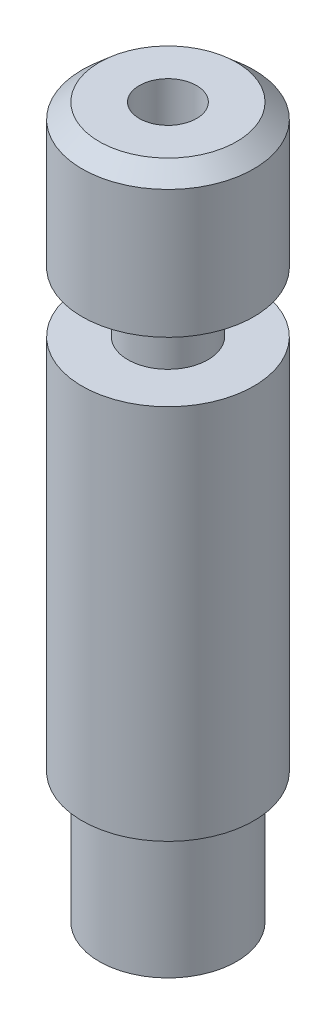
ISO-10303-21;
HEADER;
FILE_DESCRIPTION(('STEP AP214'),'2;1');
FILE_NAME('part.step','',(''),(''),'','','');
FILE_SCHEMA(('AUTOMOTIVE_DESIGN { 1 0 10303 214 1 1 1 1 }'));
ENDSEC;
DATA;
#1=APPLICATION_CONTEXT('core data for automotive mechanical design processes');
#2=APPLICATION_PROTOCOL_DEFINITION('international standard','automotive_design',2000,#1);
#3=PRODUCT_CONTEXT('',#1,'mechanical');
#4=PRODUCT('Part','Part','',(#3));
#5=PRODUCT_RELATED_PRODUCT_CATEGORY('part','',(#4));
#6=PRODUCT_DEFINITION_FORMATION('','',#4);
#7=PRODUCT_DEFINITION_CONTEXT('part definition',#1,'design');
#8=PRODUCT_DEFINITION('design','',#6,#7);
#9=PRODUCT_DEFINITION_SHAPE('','',#8);
#10=(LENGTH_UNIT() NAMED_UNIT(*) SI_UNIT(.MILLI.,.METRE.));
#11=(NAMED_UNIT(*) PLANE_ANGLE_UNIT() SI_UNIT($,.RADIAN.));
#12=(NAMED_UNIT(*) SI_UNIT($,.STERADIAN.) SOLID_ANGLE_UNIT());
#13=UNCERTAINTY_MEASURE_WITH_UNIT(LENGTH_MEASURE(1.E-05),#10,'distance_accuracy_value','');
#14=(GEOMETRIC_REPRESENTATION_CONTEXT(3) GLOBAL_UNCERTAINTY_ASSIGNED_CONTEXT((#13)) GLOBAL_UNIT_ASSIGNED_CONTEXT((#10,
#11,#12)) REPRESENTATION_CONTEXT('',''));
#15=CARTESIAN_POINT('',(0.,0.,0.));
#16=DIRECTION('',(0.,0.,1.));
#17=DIRECTION('',(1.,0.,0.));
#18=AXIS2_PLACEMENT_3D('',#15,#16,#17);
#19=CARTESIAN_POINT('',(0.,25.1,0.));
#20=DIRECTION('',(0.,1.,0.));
#21=DIRECTION('',(-1.,0.,0.));
#22=AXIS2_PLACEMENT_3D('',#19,#20,#21);
#23=CYLINDRICAL_SURFACE('',#22,0.999999999999998);
#24=CARTESIAN_POINT('',(0.,0.,0.));
#25=DIRECTION('',(0.,1.,0.));
#26=DIRECTION('',(-1.,0.,0.));
#27=AXIS2_PLACEMENT_3D('',#24,#25,#26);
#28=CIRCLE('',#27,1.);
#29=CARTESIAN_POINT('',(-1.,0.,0.));
#30=VERTEX_POINT('',#29);
#31=EDGE_CURVE('E10',#30,#30,#28,.T.);
#32=ORIENTED_EDGE('',*,*,#31,.F.);
#33=EDGE_LOOP('',(#32));
#34=FACE_BOUND('',#33,.T.);
#35=CARTESIAN_POINT('',(0.,25.1,0.));
#36=DIRECTION('',(0.,1.,0.));
#37=DIRECTION('',(-1.,0.,0.));
#38=AXIS2_PLACEMENT_3D('',#35,#36,#37);
#39=CIRCLE('',#38,0.999999999999997);
#40=CARTESIAN_POINT('',(-0.999999999999996,25.1,0.));
#41=VERTEX_POINT('',#40);
#42=EDGE_CURVE('E77',#41,#41,#39,.T.);
#43=ORIENTED_EDGE('',*,*,#42,.T.);
#44=EDGE_LOOP('',(#43));
#45=FACE_BOUND('',#44,.T.);
#46=ADVANCED_FACE('F37',(#34,#45),#23,.F.);
#47=CARTESIAN_POINT('',(0.,0.,0.));
#48=DIRECTION('',(0.,1.,0.));
#49=DIRECTION('',(-1.,0.,0.));
#50=AXIS2_PLACEMENT_3D('',#47,#48,#49);
#51=PLANE('',#50);
#52=CARTESIAN_POINT('',(0.,0.,0.));
#53=DIRECTION('',(0.,1.,0.));
#54=DIRECTION('',(-1.,0.,0.));
#55=AXIS2_PLACEMENT_3D('',#52,#53,#54);
#56=CIRCLE('',#55,1.9);
#57=CARTESIAN_POINT('',(-1.9,0.,0.));
#58=VERTEX_POINT('',#57);
#59=EDGE_CURVE('E43',#58,#58,#56,.T.);
#60=ORIENTED_EDGE('',*,*,#59,.F.);
#61=EDGE_LOOP('',(#60));
#62=FACE_BOUND('',#61,.T.);
#63=ORIENTED_EDGE('',*,*,#31,.T.);
#64=EDGE_LOOP('',(#63));
#65=FACE_BOUND('',#64,.T.);
#66=ADVANCED_FACE('F94',(#62,#65),#51,.F.);
#67=CARTESIAN_POINT('',(0.,0.,0.));
#68=DIRECTION('',(0.,1.,0.));
#69=DIRECTION('',(-1.,0.,0.));
#70=AXIS2_PLACEMENT_3D('',#67,#68,#69);
#71=CONICAL_SURFACE('',#70,1.9,1.04719755119659);
#72=CARTESIAN_POINT('',(0.,0.288675134594817,0.));
#73=DIRECTION('',(0.,1.,0.));
#74=DIRECTION('',(-1.,0.,0.));
#75=AXIS2_PLACEMENT_3D('',#72,#73,#74);
#76=CIRCLE('',#75,2.4);
#77=CARTESIAN_POINT('',(-2.4,0.288675134594817,0.));
#78=VERTEX_POINT('',#77);
#79=EDGE_CURVE('E47',#78,#78,#76,.T.);
#80=ORIENTED_EDGE('',*,*,#79,.F.);
#81=EDGE_LOOP('',(#80));
#82=FACE_BOUND('',#81,.T.);
#83=ORIENTED_EDGE('',*,*,#59,.T.);
#84=EDGE_LOOP('',(#83));
#85=FACE_BOUND('',#84,.T.);
#86=ADVANCED_FACE('F99',(#82,#85),#71,.T.);
#87=CARTESIAN_POINT('',(0.,25.1,0.));
#88=DIRECTION('',(0.,1.,0.));
#89=DIRECTION('',(-1.,0.,0.));
#90=AXIS2_PLACEMENT_3D('',#87,#88,#89);
#91=CYLINDRICAL_SURFACE('',#90,2.4);
#92=CARTESIAN_POINT('',(0.,4.5,0.));
#93=DIRECTION('',(0.,1.,0.));
#94=DIRECTION('',(-1.,0.,0.));
#95=AXIS2_PLACEMENT_3D('',#92,#93,#94);
#96=CIRCLE('',#95,2.4);
#97=CARTESIAN_POINT('',(-2.4,4.5,0.));
#98=VERTEX_POINT('',#97);
#99=EDGE_CURVE('E51',#98,#98,#96,.T.);
#100=ORIENTED_EDGE('',*,*,#99,.F.);
#101=EDGE_LOOP('',(#100));
#102=FACE_BOUND('',#101,.T.);
#103=ORIENTED_EDGE('',*,*,#79,.T.);
#104=EDGE_LOOP('',(#103));
#105=FACE_BOUND('',#104,.T.);
#106=ADVANCED_FACE('F104',(#102,#105),#91,.T.);
#107=CARTESIAN_POINT('',(0.,4.5,0.));
#108=DIRECTION('',(0.,1.,0.));
#109=DIRECTION('',(-1.,0.,0.));
#110=AXIS2_PLACEMENT_3D('',#107,#108,#109);
#111=CONICAL_SURFACE('',#110,2.4,1.0471975511966);
#112=CARTESIAN_POINT('',(0.,4.84641016151378,0.));
#113=DIRECTION('',(0.,1.,0.));
#114=DIRECTION('',(-1.,0.,0.));
#115=AXIS2_PLACEMENT_3D('',#112,#113,#114);
#116=CIRCLE('',#115,3.);
#117=CARTESIAN_POINT('',(-3.,4.84641016151378,0.));
#118=VERTEX_POINT('',#117);
#119=EDGE_CURVE('E56',#118,#118,#116,.T.);
#120=ORIENTED_EDGE('',*,*,#119,.F.);
#121=EDGE_LOOP('',(#120));
#122=FACE_BOUND('',#121,.T.);
#123=ORIENTED_EDGE('',*,*,#99,.T.);
#124=EDGE_LOOP('',(#123));
#125=FACE_BOUND('',#124,.T.);
#126=ADVANCED_FACE('F110',(#122,#125),#111,.T.);
#127=CARTESIAN_POINT('',(0.,25.1,0.));
#128=DIRECTION('',(0.,1.,0.));
#129=DIRECTION('',(-1.,0.,0.));
#130=AXIS2_PLACEMENT_3D('',#127,#128,#129);
#131=CYLINDRICAL_SURFACE('',#130,3.);
#132=CARTESIAN_POINT('',(0.,18.,0.));
#133=DIRECTION('',(0.,1.,0.));
#134=DIRECTION('',(-1.,0.,0.));
#135=AXIS2_PLACEMENT_3D('',#132,#133,#134);
#136=CIRCLE('',#135,3.);
#137=CARTESIAN_POINT('',(-3.,18.,0.));
#138=VERTEX_POINT('',#137);
#139=EDGE_CURVE('E59',#138,#138,#136,.T.);
#140=ORIENTED_EDGE('',*,*,#139,.F.);
#141=EDGE_LOOP('',(#140));
#142=FACE_BOUND('',#141,.T.);
#143=ORIENTED_EDGE('',*,*,#119,.T.);
#144=EDGE_LOOP('',(#143));
#145=FACE_BOUND('',#144,.T.);
#146=ADVANCED_FACE('F114',(#142,#145),#131,.T.);
#147=CARTESIAN_POINT('',(0.,18.,0.));
#148=DIRECTION('',(0.,-1.,0.));
#149=DIRECTION('',(1.,0.,0.));
#150=AXIS2_PLACEMENT_3D('',#147,#148,#149);
#151=PLANE('',#150);
#152=CARTESIAN_POINT('',(0.,18.,0.));
#153=DIRECTION('',(0.,1.,0.));
#154=DIRECTION('',(-1.,0.,0.));
#155=AXIS2_PLACEMENT_3D('',#152,#153,#154);
#156=CIRCLE('',#155,1.4);
#157=CARTESIAN_POINT('',(-1.4,18.,0.));
#158=VERTEX_POINT('',#157);
#159=EDGE_CURVE('E62',#158,#158,#156,.T.);
#160=ORIENTED_EDGE('',*,*,#159,.F.);
#161=EDGE_LOOP('',(#160));
#162=FACE_BOUND('',#161,.T.);
#163=ORIENTED_EDGE('',*,*,#139,.T.);
#164=EDGE_LOOP('',(#163));
#165=FACE_BOUND('',#164,.T.);
#166=ADVANCED_FACE('F118',(#162,#165),#151,.F.);
#167=CARTESIAN_POINT('',(0.,25.1,0.));
#168=DIRECTION('',(0.,1.,0.));
#169=DIRECTION('',(-1.,0.,0.));
#170=AXIS2_PLACEMENT_3D('',#167,#168,#169);
#171=CYLINDRICAL_SURFACE('',#170,1.4);
#172=CARTESIAN_POINT('',(0.,20.1,0.));
#173=DIRECTION('',(0.,1.,0.));
#174=DIRECTION('',(-1.,0.,0.));
#175=AXIS2_PLACEMENT_3D('',#172,#173,#174);
#176=CIRCLE('',#175,1.4);
#177=CARTESIAN_POINT('',(-1.4,20.1,0.));
#178=VERTEX_POINT('',#177);
#179=EDGE_CURVE('E65',#178,#178,#176,.T.);
#180=ORIENTED_EDGE('',*,*,#179,.F.);
#181=EDGE_LOOP('',(#180));
#182=FACE_BOUND('',#181,.T.);
#183=ORIENTED_EDGE('',*,*,#159,.T.);
#184=EDGE_LOOP('',(#183));
#185=FACE_BOUND('',#184,.T.);
#186=ADVANCED_FACE('F122',(#182,#185),#171,.T.);
#187=CARTESIAN_POINT('',(0.,20.1,0.));
#188=DIRECTION('',(0.,1.,0.));
#189=DIRECTION('',(-1.,0.,0.));
#190=AXIS2_PLACEMENT_3D('',#187,#188,#189);
#191=PLANE('',#190);
#192=CARTESIAN_POINT('',(0.,20.1,0.));
#193=DIRECTION('',(0.,1.,0.));
#194=DIRECTION('',(-1.,0.,0.));
#195=AXIS2_PLACEMENT_3D('',#192,#193,#194);
#196=CIRCLE('',#195,3.);
#197=CARTESIAN_POINT('',(-3.,20.1,0.));
#198=VERTEX_POINT('',#197);
#199=EDGE_CURVE('E68',#198,#198,#196,.T.);
#200=ORIENTED_EDGE('',*,*,#199,.F.);
#201=EDGE_LOOP('',(#200));
#202=FACE_BOUND('',#201,.T.);
#203=ORIENTED_EDGE('',*,*,#179,.T.);
#204=EDGE_LOOP('',(#203));
#205=FACE_BOUND('',#204,.T.);
#206=ADVANCED_FACE('F126',(#202,#205),#191,.F.);
#207=CARTESIAN_POINT('',(0.,25.1,0.));
#208=DIRECTION('',(0.,1.,0.));
#209=DIRECTION('',(-1.,0.,0.));
#210=AXIS2_PLACEMENT_3D('',#207,#208,#209);
#211=CYLINDRICAL_SURFACE('',#210,3.);
#212=CARTESIAN_POINT('',(0.,24.5749144495437,0.));
#213=DIRECTION('',(0.,1.,0.));
#214=DIRECTION('',(-1.,0.,0.));
#215=AXIS2_PLACEMENT_3D('',#212,#213,#214);
#216=CIRCLE('',#215,3.);
#217=CARTESIAN_POINT('',(-3.,24.5749144495437,0.));
#218=VERTEX_POINT('',#217);
#219=EDGE_CURVE('E71',#218,#218,#216,.T.);
#220=ORIENTED_EDGE('',*,*,#219,.F.);
#221=EDGE_LOOP('',(#220));
#222=FACE_BOUND('',#221,.T.);
#223=ORIENTED_EDGE('',*,*,#199,.T.);
#224=EDGE_LOOP('',(#223));
#225=FACE_BOUND('',#224,.T.);
#226=ADVANCED_FACE('F90',(#222,#225),#211,.T.);
#227=CARTESIAN_POINT('',(0.,24.5749144495437,0.));
#228=DIRECTION('',(0.,-1.,0.));
#229=DIRECTION('',(1.,0.,0.));
#230=AXIS2_PLACEMENT_3D('',#227,#228,#229);
#231=CONICAL_SURFACE('',#230,3.,0.851885577286398);
#232=CARTESIAN_POINT('',(0.,25.1,0.));
#233=DIRECTION('',(0.,1.,0.));
#234=DIRECTION('',(-1.,0.,0.));
#235=AXIS2_PLACEMENT_3D('',#232,#233,#234);
#236=CIRCLE('',#235,2.4);
#237=CARTESIAN_POINT('',(-2.4,25.1,0.));
#238=VERTEX_POINT('',#237);
#239=EDGE_CURVE('E74',#238,#238,#236,.T.);
#240=ORIENTED_EDGE('',*,*,#239,.F.);
#241=EDGE_LOOP('',(#240));
#242=FACE_BOUND('',#241,.T.);
#243=ORIENTED_EDGE('',*,*,#219,.T.);
#244=EDGE_LOOP('',(#243));
#245=FACE_BOUND('',#244,.T.);
#246=ADVANCED_FACE('F84',(#242,#245),#231,.T.);
#247=CARTESIAN_POINT('',(0.,25.1,0.));
#248=DIRECTION('',(0.,1.,0.));
#249=DIRECTION('',(-1.,0.,0.));
#250=AXIS2_PLACEMENT_3D('',#247,#248,#249);
#251=PLANE('',#250);
#252=ORIENTED_EDGE('',*,*,#239,.T.);
#253=EDGE_LOOP('',(#252));
#254=FACE_BOUND('',#253,.T.);
#255=ORIENTED_EDGE('',*,*,#42,.F.);
#256=EDGE_LOOP('',(#255));
#257=FACE_BOUND('',#256,.T.);
#258=ADVANCED_FACE('F82',(#254,#257),#251,.T.);
#259=CLOSED_SHELL('',(#46,#66,#86,#106,#126,#146,#166,#186,#206,#226,#246,#258));
#260=MANIFOLD_SOLID_BREP('B2',#259);
#261=ADVANCED_BREP_SHAPE_REPRESENTATION('',(#18,#260),#14);
#262=SHAPE_DEFINITION_REPRESENTATION(#9,#261);
ENDSEC;
END-ISO-10303-21;
